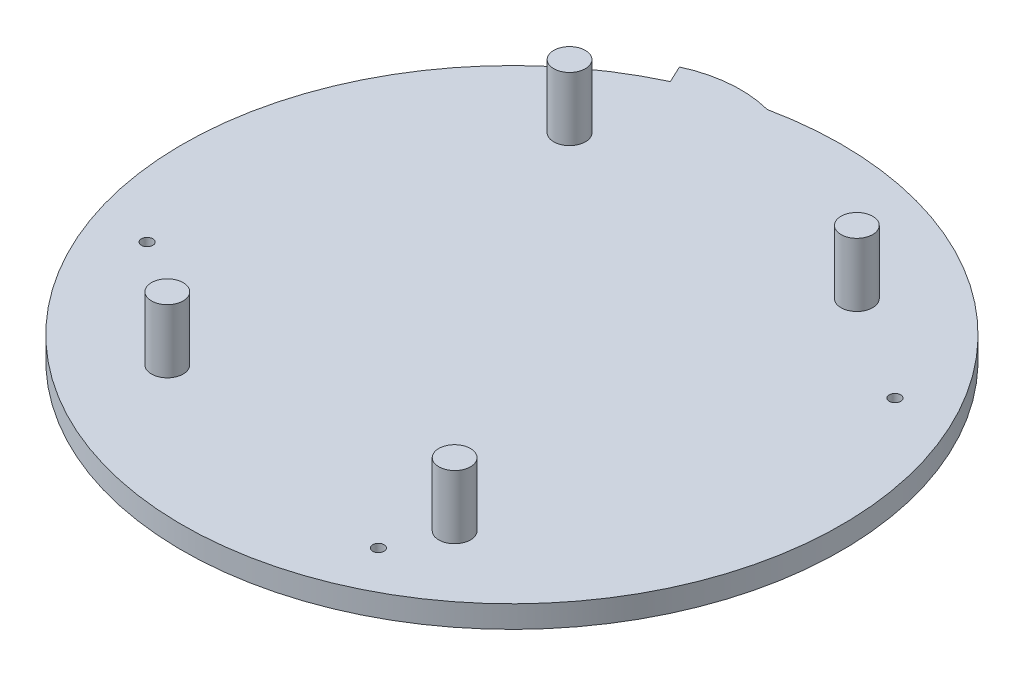
ISO-10303-21;
HEADER;
FILE_DESCRIPTION(('STEP AP214'),'2;1');
FILE_NAME('part.step','',(''),(''),'','','');
FILE_SCHEMA(('AUTOMOTIVE_DESIGN { 1 0 10303 214 1 1 1 1 }'));
ENDSEC;
DATA;
#1=APPLICATION_CONTEXT('core data for automotive mechanical design processes');
#2=APPLICATION_PROTOCOL_DEFINITION('international standard','automotive_design',2000,#1);
#3=PRODUCT_CONTEXT('',#1,'mechanical');
#4=PRODUCT('Part','Part','',(#3));
#5=PRODUCT_RELATED_PRODUCT_CATEGORY('part','',(#4));
#6=PRODUCT_DEFINITION_FORMATION('','',#4);
#7=PRODUCT_DEFINITION_CONTEXT('part definition',#1,'design');
#8=PRODUCT_DEFINITION('design','',#6,#7);
#9=PRODUCT_DEFINITION_SHAPE('','',#8);
#10=(LENGTH_UNIT() NAMED_UNIT(*) SI_UNIT(.MILLI.,.METRE.));
#11=(NAMED_UNIT(*) PLANE_ANGLE_UNIT() SI_UNIT($,.RADIAN.));
#12=(NAMED_UNIT(*) SI_UNIT($,.STERADIAN.) SOLID_ANGLE_UNIT());
#13=UNCERTAINTY_MEASURE_WITH_UNIT(LENGTH_MEASURE(1.E-05),#10,'distance_accuracy_value','');
#14=(GEOMETRIC_REPRESENTATION_CONTEXT(3) GLOBAL_UNCERTAINTY_ASSIGNED_CONTEXT((#13)) GLOBAL_UNIT_ASSIGNED_CONTEXT((#10,
#11,#12)) REPRESENTATION_CONTEXT('',''));
#15=CARTESIAN_POINT('',(0.,0.,0.));
#16=DIRECTION('',(0.,0.,1.));
#17=DIRECTION('',(1.,0.,0.));
#18=AXIS2_PLACEMENT_3D('',#15,#16,#17);
#19=CARTESIAN_POINT('',(0.383365043907791,3.5,0.411535967729026));
#20=DIRECTION('',(0.,-1.,0.));
#21=DIRECTION('',(0.,0.,-1.));
#22=AXIS2_PLACEMENT_3D('',#19,#20,#21);
#23=CYLINDRICAL_SURFACE('',#22,51.9999999999998);
#24=CARTESIAN_POINT('',(0.383365043907791,0.,0.411535967729026));
#25=DIRECTION('',(0.,1.,0.));
#26=DIRECTION('',(0.,0.,1.));
#27=AXIS2_PLACEMENT_3D('',#24,#25,#26);
#28=CIRCLE('',#27,51.9999999999998);
#29=CARTESIAN_POINT('',(-21.7020782907595,0.,-46.6653500031079));
#30=VERTEX_POINT('',#29);
#31=CARTESIAN_POINT('',(-10.2420625234784,0.,-50.4913155143855));
#32=VERTEX_POINT('',#31);
#33=EDGE_CURVE('E88',#30,#32,#28,.T.);
#34=ORIENTED_EDGE('',*,*,#33,.T.);
#35=DIRECTION('',(0.,-1.,0.));
#36=VECTOR('',#35,1.);
#37=CARTESIAN_POINT('',(-10.2420625234784,3.5,-50.4913155143855));
#38=LINE('',#37,#36);
#39=CARTESIAN_POINT('',(-10.2420625234784,3.5,-50.4913155143855));
#40=VERTEX_POINT('',#39);
#41=EDGE_CURVE('E45',#40,#32,#38,.T.);
#42=ORIENTED_EDGE('',*,*,#41,.F.);
#43=CARTESIAN_POINT('',(0.383365043907791,3.5,0.411535967729026));
#44=DIRECTION('',(0.,1.,0.));
#45=DIRECTION('',(0.,0.,1.));
#46=AXIS2_PLACEMENT_3D('',#43,#44,#45);
#47=CIRCLE('',#46,51.9999999999998);
#48=CARTESIAN_POINT('',(-21.7020782907595,3.5,-46.6653500031079));
#49=VERTEX_POINT('',#48);
#50=EDGE_CURVE('E84',#49,#40,#47,.T.);
#51=ORIENTED_EDGE('',*,*,#50,.F.);
#52=DIRECTION('',(0.,-1.,0.));
#53=VECTOR('',#52,1.);
#54=CARTESIAN_POINT('',(-21.7020782907595,3.5,-46.6653500031079));
#55=LINE('',#54,#53);
#56=EDGE_CURVE('E94',#49,#30,#55,.T.);
#57=ORIENTED_EDGE('',*,*,#56,.T.);
#58=EDGE_LOOP('',(#34,#42,#51,#57));
#59=FACE_BOUND('',#58,.T.);
#60=ADVANCED_FACE('F39',(#59),#23,.T.);
#61=CARTESIAN_POINT('',(-15.0553927099154,3.5,-32.1111127811093));
#62=DIRECTION('',(0.,-1.,0.));
#63=DIRECTION('',(0.,0.,-1.));
#64=AXIS2_PLACEMENT_3D('',#61,#62,#63);
#65=CYLINDRICAL_SURFACE('',#64,19.);
#66=CARTESIAN_POINT('',(-15.0553927099154,0.,-32.1111127811093));
#67=DIRECTION('',(0.,1.,0.));
#68=DIRECTION('',(0.,0.,1.));
#69=AXIS2_PLACEMENT_3D('',#66,#67,#68);
#70=CIRCLE('',#69,19.);
#71=CARTESIAN_POINT('',(-22.9762384831442,0.,-49.3813241937331));
#72=VERTEX_POINT('',#71);
#73=EDGE_CURVE('E68',#32,#72,#70,.T.);
#74=ORIENTED_EDGE('',*,*,#73,.T.);
#75=DIRECTION('',(0.,-1.,0.));
#76=VECTOR('',#75,1.);
#77=CARTESIAN_POINT('',(-22.9762384831442,3.5,-49.3813241937331));
#78=LINE('',#77,#76);
#79=CARTESIAN_POINT('',(-22.9762384831442,3.5,-49.3813241937331));
#80=VERTEX_POINT('',#79);
#81=EDGE_CURVE('E85',#80,#72,#78,.T.);
#82=ORIENTED_EDGE('',*,*,#81,.F.);
#83=CARTESIAN_POINT('',(-15.0553927099154,3.5,-32.1111127811093));
#84=DIRECTION('',(0.,1.,0.));
#85=DIRECTION('',(0.,0.,1.));
#86=AXIS2_PLACEMENT_3D('',#83,#84,#85);
#87=CIRCLE('',#86,19.);
#88=EDGE_CURVE('E76',#40,#80,#87,.T.);
#89=ORIENTED_EDGE('',*,*,#88,.F.);
#90=ORIENTED_EDGE('',*,*,#41,.T.);
#91=EDGE_LOOP('',(#74,#82,#89,#90));
#92=FACE_BOUND('',#91,.T.);
#93=ADVANCED_FACE('F79',(#92),#65,.T.);
#94=CARTESIAN_POINT('',(-21.7020782907595,3.5,-46.6653500031079));
#95=DIRECTION('',(0.905324730208406,0.,-0.424720064128216));
#96=DIRECTION('',(-0.424720064128217,0.,-0.905324730208406));
#97=AXIS2_PLACEMENT_3D('',#94,#95,#96);
#98=PLANE('',#97);
#99=DIRECTION('',(0.424720064128217,0.,0.905324730208406));
#100=VECTOR('',#99,1.);
#101=CARTESIAN_POINT('',(-21.7020782907595,0.,-46.6653500031079));
#102=LINE('',#101,#100);
#103=EDGE_CURVE('E74',#72,#30,#102,.T.);
#104=ORIENTED_EDGE('',*,*,#103,.T.);
#105=ORIENTED_EDGE('',*,*,#56,.F.);
#106=DIRECTION('',(0.424720064128217,0.,0.905324730208406));
#107=VECTOR('',#106,1.);
#108=CARTESIAN_POINT('',(-21.7020782907595,3.5,-46.6653500031079));
#109=LINE('',#108,#107);
#110=EDGE_CURVE('E60',#80,#49,#109,.T.);
#111=ORIENTED_EDGE('',*,*,#110,.F.);
#112=ORIENTED_EDGE('',*,*,#81,.T.);
#113=EDGE_LOOP('',(#104,#105,#111,#112));
#114=FACE_BOUND('',#113,.T.);
#115=ADVANCED_FACE('F158',(#114),#98,.F.);
#116=CARTESIAN_POINT('',(0.383365043907791,3.5,0.411535967729026));
#117=DIRECTION('',(0.,1.,0.));
#118=DIRECTION('',(0.,0.,1.));
#119=AXIS2_PLACEMENT_3D('',#116,#117,#118);
#120=PLANE('',#119);
#121=CARTESIAN_POINT('',(18.9958266832934,3.5,40.0854841405765));
#122=DIRECTION('',(0.,1.,0.));
#123=DIRECTION('',(0.,0.,1.));
#124=AXIS2_PLACEMENT_3D('',#121,#122,#123);
#125=CIRCLE('',#124,0.899999999999996);
#126=CARTESIAN_POINT('',(18.9958266832934,3.5,40.9854841405765));
#127=VERTEX_POINT('',#126);
#128=EDGE_CURVE('E122',#127,#127,#125,.T.);
#129=ORIENTED_EDGE('',*,*,#128,.F.);
#130=EDGE_LOOP('',(#129));
#131=FACE_BOUND('',#130,.T.);
#132=CARTESIAN_POINT('',(-22.6616761266969,3.5,31.7263465773757));
#133=DIRECTION('',(0.,1.,0.));
#134=DIRECTION('',(0.,0.,-1.));
#135=AXIS2_PLACEMENT_3D('',#132,#133,#134);
#136=CIRCLE('',#135,2.5);
#137=CARTESIAN_POINT('',(-22.6616761266969,3.5,29.2263465773757));
#138=VERTEX_POINT('',#137);
#139=EDGE_CURVE('E11',#138,#138,#136,.T.);
#140=ORIENTED_EDGE('',*,*,#139,.F.);
#141=EDGE_LOOP('',(#140));
#142=FACE_BOUND('',#141,.T.);
#143=CARTESIAN_POINT('',(22.6616761266969,3.5,31.7263465773757));
#144=DIRECTION('',(0.,1.,0.));
#145=DIRECTION('',(0.,0.,-1.));
#146=AXIS2_PLACEMENT_3D('',#143,#144,#145);
#147=CIRCLE('',#146,2.5);
#148=CARTESIAN_POINT('',(22.6616761266969,3.5,29.2263465773757));
#149=VERTEX_POINT('',#148);
#150=EDGE_CURVE('E48',#149,#149,#147,.T.);
#151=ORIENTED_EDGE('',*,*,#150,.F.);
#152=EDGE_LOOP('',(#151));
#153=FACE_BOUND('',#152,.T.);
#154=CARTESIAN_POINT('',(22.6616761266969,3.5,-31.7263465773757));
#155=DIRECTION('',(0.,1.,0.));
#156=DIRECTION('',(0.,0.,1.));
#157=AXIS2_PLACEMENT_3D('',#154,#155,#156);
#158=CIRCLE('',#157,2.5);
#159=CARTESIAN_POINT('',(22.6616761266969,3.5,-29.2263465773757));
#160=VERTEX_POINT('',#159);
#161=EDGE_CURVE('E91',#160,#160,#158,.T.);
#162=ORIENTED_EDGE('',*,*,#161,.F.);
#163=EDGE_LOOP('',(#162));
#164=FACE_BOUND('',#163,.T.);
#165=CARTESIAN_POINT('',(-22.6616761266969,3.5,-31.7263465773757));
#166=DIRECTION('',(0.,1.,0.));
#167=DIRECTION('',(0.,0.,1.));
#168=AXIS2_PLACEMENT_3D('',#165,#166,#167);
#169=CIRCLE('',#168,2.5);
#170=CARTESIAN_POINT('',(-22.6616761266969,3.5,-29.2263465773757));
#171=VERTEX_POINT('',#170);
#172=EDGE_CURVE('E93',#171,#171,#169,.T.);
#173=ORIENTED_EDGE('',*,*,#172,.F.);
#174=EDGE_LOOP('',(#173));
#175=FACE_BOUND('',#174,.T.);
#176=CARTESIAN_POINT('',(-41.040664552583,3.5,16.5312950107757));
#177=DIRECTION('',(0.,1.,0.));
#178=DIRECTION('',(0.,0.,1.));
#179=AXIS2_PLACEMENT_3D('',#176,#177,#178);
#180=CIRCLE('',#179,0.899999999999996);
#181=CARTESIAN_POINT('',(-41.040664552583,3.5,17.4312950107757));
#182=VERTEX_POINT('',#181);
#183=EDGE_CURVE('E109',#182,#182,#180,.T.);
#184=ORIENTED_EDGE('',*,*,#183,.F.);
#185=EDGE_LOOP('',(#184));
#186=FACE_BOUND('',#185,.T.);
#187=CARTESIAN_POINT('',(39.259074255629,3.5,-21.1401714565677));
#188=DIRECTION('',(0.,1.,0.));
#189=DIRECTION('',(0.,0.,1.));
#190=AXIS2_PLACEMENT_3D('',#187,#188,#189);
#191=CIRCLE('',#190,0.899999999999996);
#192=CARTESIAN_POINT('',(39.259074255629,3.5,-20.2401714565677));
#193=VERTEX_POINT('',#192);
#194=EDGE_CURVE('E106',#193,#193,#191,.T.);
#195=ORIENTED_EDGE('',*,*,#194,.F.);
#196=EDGE_LOOP('',(#195));
#197=FACE_BOUND('',#196,.T.);
#198=ORIENTED_EDGE('',*,*,#50,.T.);
#199=ORIENTED_EDGE('',*,*,#88,.T.);
#200=ORIENTED_EDGE('',*,*,#110,.T.);
#201=EDGE_LOOP('',(#198,#199,#200));
#202=FACE_BOUND('',#201,.T.);
#203=ADVANCED_FACE('F87',(#131,#142,#153,#164,#175,#186,#197,#202),#120,.T.);
#204=CARTESIAN_POINT('',(0.383365043907791,0.,0.411535967729026));
#205=DIRECTION('',(0.,1.,0.));
#206=DIRECTION('',(0.,0.,1.));
#207=AXIS2_PLACEMENT_3D('',#204,#205,#206);
#208=PLANE('',#207);
#209=CARTESIAN_POINT('',(18.9958266832934,0.,40.0854841405765));
#210=DIRECTION('',(0.,-1.,0.));
#211=DIRECTION('',(0.,0.,-1.));
#212=AXIS2_PLACEMENT_3D('',#209,#210,#211);
#213=CIRCLE('',#212,0.899999999999996);
#214=CARTESIAN_POINT('',(18.9958266832934,0.,39.1854841405765));
#215=VERTEX_POINT('',#214);
#216=EDGE_CURVE('E134',#215,#215,#213,.T.);
#217=ORIENTED_EDGE('',*,*,#216,.F.);
#218=EDGE_LOOP('',(#217));
#219=FACE_BOUND('',#218,.T.);
#220=CARTESIAN_POINT('',(-41.040664552583,0.,16.5312950107757));
#221=DIRECTION('',(0.,1.,0.));
#222=DIRECTION('',(0.,0.,1.));
#223=AXIS2_PLACEMENT_3D('',#220,#221,#222);
#224=CIRCLE('',#223,0.899999999999996);
#225=CARTESIAN_POINT('',(-41.040664552583,0.,17.4312950107757));
#226=VERTEX_POINT('',#225);
#227=EDGE_CURVE('E103',#226,#226,#224,.T.);
#228=ORIENTED_EDGE('',*,*,#227,.T.);
#229=EDGE_LOOP('',(#228));
#230=FACE_BOUND('',#229,.T.);
#231=CARTESIAN_POINT('',(39.259074255629,0.,-21.1401714565677));
#232=DIRECTION('',(0.,1.,0.));
#233=DIRECTION('',(0.,0.,1.));
#234=AXIS2_PLACEMENT_3D('',#231,#232,#233);
#235=CIRCLE('',#234,0.899999999999996);
#236=CARTESIAN_POINT('',(39.259074255629,0.,-20.2401714565677));
#237=VERTEX_POINT('',#236);
#238=EDGE_CURVE('E101',#237,#237,#235,.T.);
#239=ORIENTED_EDGE('',*,*,#238,.T.);
#240=EDGE_LOOP('',(#239));
#241=FACE_BOUND('',#240,.T.);
#242=ORIENTED_EDGE('',*,*,#33,.F.);
#243=ORIENTED_EDGE('',*,*,#103,.F.);
#244=ORIENTED_EDGE('',*,*,#73,.F.);
#245=EDGE_LOOP('',(#242,#243,#244));
#246=FACE_BOUND('',#245,.T.);
#247=ADVANCED_FACE('F137',(#219,#230,#241,#246),#208,.F.);
#248=CARTESIAN_POINT('',(39.259074255629,0.,-21.1401714565677));
#249=DIRECTION('',(0.,1.,0.));
#250=DIRECTION('',(0.,0.,1.));
#251=AXIS2_PLACEMENT_3D('',#248,#249,#250);
#252=CYLINDRICAL_SURFACE('',#251,0.899999999999996);
#253=ORIENTED_EDGE('',*,*,#238,.F.);
#254=EDGE_LOOP('',(#253));
#255=FACE_BOUND('',#254,.T.);
#256=ORIENTED_EDGE('',*,*,#194,.T.);
#257=EDGE_LOOP('',(#256));
#258=FACE_BOUND('',#257,.T.);
#259=ADVANCED_FACE('F145',(#255,#258),#252,.F.);
#260=CARTESIAN_POINT('',(-41.040664552583,0.,16.5312950107757));
#261=DIRECTION('',(0.,1.,0.));
#262=DIRECTION('',(0.,0.,1.));
#263=AXIS2_PLACEMENT_3D('',#260,#261,#262);
#264=CYLINDRICAL_SURFACE('',#263,0.899999999999996);
#265=ORIENTED_EDGE('',*,*,#227,.F.);
#266=EDGE_LOOP('',(#265));
#267=FACE_BOUND('',#266,.T.);
#268=ORIENTED_EDGE('',*,*,#183,.T.);
#269=EDGE_LOOP('',(#268));
#270=FACE_BOUND('',#269,.T.);
#271=ADVANCED_FACE('F152',(#267,#270),#264,.F.);
#272=CARTESIAN_POINT('',(-22.6616761266969,13.5,-31.7263465773757));
#273=DIRECTION('',(0.,-1.,0.));
#274=DIRECTION('',(0.,0.,-1.));
#275=AXIS2_PLACEMENT_3D('',#272,#273,#274);
#276=CYLINDRICAL_SURFACE('',#275,2.5);
#277=CARTESIAN_POINT('',(-22.6616761266969,13.5,-31.7263465773757));
#278=DIRECTION('',(0.,1.,0.));
#279=DIRECTION('',(0.,0.,1.));
#280=AXIS2_PLACEMENT_3D('',#277,#278,#279);
#281=CIRCLE('',#280,2.5);
#282=CARTESIAN_POINT('',(-22.6616761266969,13.5,-29.2263465773757));
#283=VERTEX_POINT('',#282);
#284=EDGE_CURVE('E110',#283,#283,#281,.T.);
#285=ORIENTED_EDGE('',*,*,#284,.F.);
#286=EDGE_LOOP('',(#285));
#287=FACE_BOUND('',#286,.T.);
#288=ORIENTED_EDGE('',*,*,#172,.T.);
#289=EDGE_LOOP('',(#288));
#290=FACE_BOUND('',#289,.T.);
#291=ADVANCED_FACE('F188',(#287,#290),#276,.T.);
#292=CARTESIAN_POINT('',(-22.6616761266969,13.5,-31.7263465773757));
#293=DIRECTION('',(0.,1.,0.));
#294=DIRECTION('',(0.,0.,1.));
#295=AXIS2_PLACEMENT_3D('',#292,#293,#294);
#296=PLANE('',#295);
#297=ORIENTED_EDGE('',*,*,#284,.T.);
#298=EDGE_LOOP('',(#297));
#299=FACE_BOUND('',#298,.T.);
#300=ADVANCED_FACE('F196',(#299),#296,.T.);
#301=CARTESIAN_POINT('',(22.6616761266969,13.5,-31.7263465773757));
#302=DIRECTION('',(0.,-1.,0.));
#303=DIRECTION('',(0.,0.,-1.));
#304=AXIS2_PLACEMENT_3D('',#301,#302,#303);
#305=CYLINDRICAL_SURFACE('',#304,2.5);
#306=CARTESIAN_POINT('',(22.6616761266969,13.5,-31.7263465773757));
#307=DIRECTION('',(0.,1.,0.));
#308=DIRECTION('',(0.,0.,1.));
#309=AXIS2_PLACEMENT_3D('',#306,#307,#308);
#310=CIRCLE('',#309,2.5);
#311=CARTESIAN_POINT('',(22.6616761266969,13.5,-29.2263465773757));
#312=VERTEX_POINT('',#311);
#313=EDGE_CURVE('E120',#312,#312,#310,.T.);
#314=ORIENTED_EDGE('',*,*,#313,.F.);
#315=EDGE_LOOP('',(#314));
#316=FACE_BOUND('',#315,.T.);
#317=ORIENTED_EDGE('',*,*,#161,.T.);
#318=EDGE_LOOP('',(#317));
#319=FACE_BOUND('',#318,.T.);
#320=ADVANCED_FACE('F206',(#316,#319),#305,.T.);
#321=CARTESIAN_POINT('',(22.6616761266969,13.5,-31.7263465773757));
#322=DIRECTION('',(0.,1.,0.));
#323=DIRECTION('',(0.,0.,1.));
#324=AXIS2_PLACEMENT_3D('',#321,#322,#323);
#325=PLANE('',#324);
#326=ORIENTED_EDGE('',*,*,#313,.T.);
#327=EDGE_LOOP('',(#326));
#328=FACE_BOUND('',#327,.T.);
#329=ADVANCED_FACE('F220',(#328),#325,.T.);
#330=CARTESIAN_POINT('',(22.6616761266969,13.5,31.7263465773757));
#331=DIRECTION('',(0.,-1.,0.));
#332=DIRECTION('',(0.,0.,-1.));
#333=AXIS2_PLACEMENT_3D('',#330,#331,#332);
#334=CYLINDRICAL_SURFACE('',#333,2.5);
#335=CARTESIAN_POINT('',(22.6616761266969,13.5,31.7263465773757));
#336=DIRECTION('',(0.,1.,0.));
#337=DIRECTION('',(0.,0.,-1.));
#338=AXIS2_PLACEMENT_3D('',#335,#336,#337);
#339=CIRCLE('',#338,2.5);
#340=CARTESIAN_POINT('',(22.6616761266969,13.5,29.2263465773757));
#341=VERTEX_POINT('',#340);
#342=EDGE_CURVE('E119',#341,#341,#339,.T.);
#343=ORIENTED_EDGE('',*,*,#342,.F.);
#344=EDGE_LOOP('',(#343));
#345=FACE_BOUND('',#344,.T.);
#346=ORIENTED_EDGE('',*,*,#150,.T.);
#347=EDGE_LOOP('',(#346));
#348=FACE_BOUND('',#347,.T.);
#349=ADVANCED_FACE('F228',(#345,#348),#334,.T.);
#350=CARTESIAN_POINT('',(22.6616761266969,13.5,31.7263465773757));
#351=DIRECTION('',(0.,-1.,0.));
#352=DIRECTION('',(0.,0.,-1.));
#353=AXIS2_PLACEMENT_3D('',#350,#351,#352);
#354=PLANE('',#353);
#355=ORIENTED_EDGE('',*,*,#342,.T.);
#356=EDGE_LOOP('',(#355));
#357=FACE_BOUND('',#356,.T.);
#358=ADVANCED_FACE('F232',(#357),#354,.F.);
#359=CARTESIAN_POINT('',(-22.6616761266969,13.5,31.7263465773757));
#360=DIRECTION('',(0.,-1.,0.));
#361=DIRECTION('',(0.,0.,-1.));
#362=AXIS2_PLACEMENT_3D('',#359,#360,#361);
#363=CYLINDRICAL_SURFACE('',#362,2.5);
#364=CARTESIAN_POINT('',(-22.6616761266969,13.5,31.7263465773757));
#365=DIRECTION('',(0.,1.,0.));
#366=DIRECTION('',(0.,0.,-1.));
#367=AXIS2_PLACEMENT_3D('',#364,#365,#366);
#368=CIRCLE('',#367,2.5);
#369=CARTESIAN_POINT('',(-22.6616761266969,13.5,29.2263465773757));
#370=VERTEX_POINT('',#369);
#371=EDGE_CURVE('E117',#370,#370,#368,.T.);
#372=ORIENTED_EDGE('',*,*,#371,.F.);
#373=EDGE_LOOP('',(#372));
#374=FACE_BOUND('',#373,.T.);
#375=ORIENTED_EDGE('',*,*,#139,.T.);
#376=EDGE_LOOP('',(#375));
#377=FACE_BOUND('',#376,.T.);
#378=ADVANCED_FACE('F242',(#374,#377),#363,.T.);
#379=CARTESIAN_POINT('',(-22.6616761266969,13.5,31.7263465773757));
#380=DIRECTION('',(0.,-1.,0.));
#381=DIRECTION('',(0.,0.,-1.));
#382=AXIS2_PLACEMENT_3D('',#379,#380,#381);
#383=PLANE('',#382);
#384=ORIENTED_EDGE('',*,*,#371,.T.);
#385=EDGE_LOOP('',(#384));
#386=FACE_BOUND('',#385,.T.);
#387=ADVANCED_FACE('F255',(#386),#383,.F.);
#388=CARTESIAN_POINT('',(18.9958266832934,10.,40.0854841405765));
#389=DIRECTION('',(0.,-1.,0.));
#390=DIRECTION('',(0.,0.,-1.));
#391=AXIS2_PLACEMENT_3D('',#388,#389,#390);
#392=CYLINDRICAL_SURFACE('',#391,0.899999999999996);
#393=ORIENTED_EDGE('',*,*,#128,.T.);
#394=EDGE_LOOP('',(#393));
#395=FACE_BOUND('',#394,.T.);
#396=ORIENTED_EDGE('',*,*,#216,.T.);
#397=EDGE_LOOP('',(#396));
#398=FACE_BOUND('',#397,.T.);
#399=ADVANCED_FACE('F140',(#395,#398),#392,.F.);
#400=CLOSED_SHELL('',(#60,#93,#115,#203,#247,#259,#271,#291,#300,#320,#329,#349,#358,#378,#387,#399));
#401=MANIFOLD_SOLID_BREP('B2',#400);
#402=ADVANCED_BREP_SHAPE_REPRESENTATION('',(#18,#401),#14);
#403=SHAPE_DEFINITION_REPRESENTATION(#9,#402);
ENDSEC;
END-ISO-10303-21;
